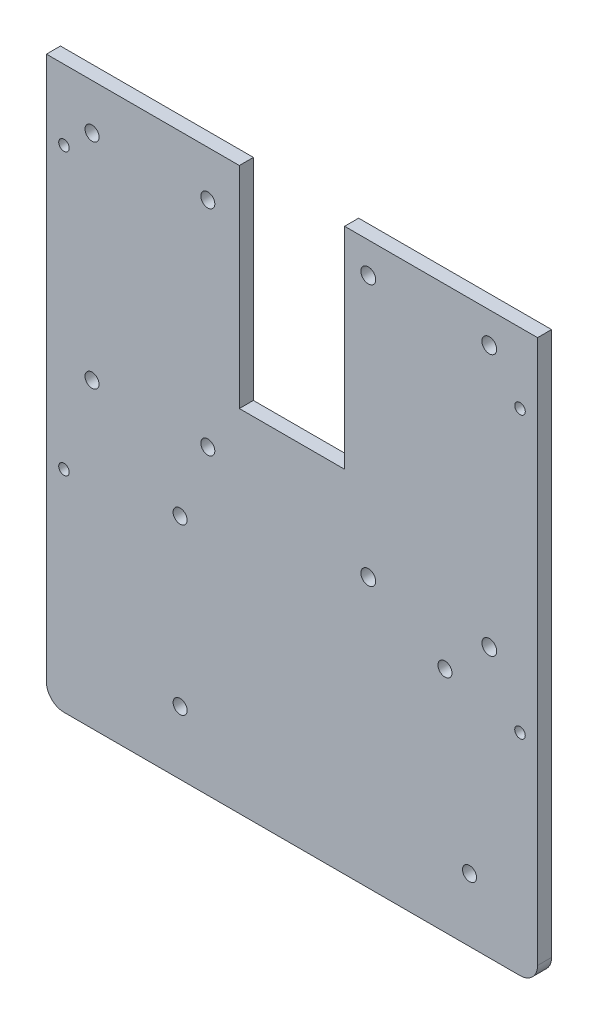
ISO-10303-21;
HEADER;
FILE_DESCRIPTION(('STEP AP214'),'2;1');
FILE_NAME('part.step','',(''),(''),'','','');
FILE_SCHEMA(('AUTOMOTIVE_DESIGN { 1 0 10303 214 1 1 1 1 }'));
ENDSEC;
DATA;
#1=APPLICATION_CONTEXT('core data for automotive mechanical design processes');
#2=APPLICATION_PROTOCOL_DEFINITION('international standard','automotive_design',2000,#1);
#3=PRODUCT_CONTEXT('',#1,'mechanical');
#4=PRODUCT('Part','Part','',(#3));
#5=PRODUCT_RELATED_PRODUCT_CATEGORY('part','',(#4));
#6=PRODUCT_DEFINITION_FORMATION('','',#4);
#7=PRODUCT_DEFINITION_CONTEXT('part definition',#1,'design');
#8=PRODUCT_DEFINITION('design','',#6,#7);
#9=PRODUCT_DEFINITION_SHAPE('','',#8);
#10=(LENGTH_UNIT() NAMED_UNIT(*) SI_UNIT(.MILLI.,.METRE.));
#11=(NAMED_UNIT(*) PLANE_ANGLE_UNIT() SI_UNIT($,.RADIAN.));
#12=(NAMED_UNIT(*) SI_UNIT($,.STERADIAN.) SOLID_ANGLE_UNIT());
#13=UNCERTAINTY_MEASURE_WITH_UNIT(LENGTH_MEASURE(1.E-05),#10,'distance_accuracy_value','');
#14=(GEOMETRIC_REPRESENTATION_CONTEXT(3) GLOBAL_UNCERTAINTY_ASSIGNED_CONTEXT((#13)) GLOBAL_UNIT_ASSIGNED_CONTEXT((#10,
#11,#12)) REPRESENTATION_CONTEXT('',''));
#15=CARTESIAN_POINT('',(0.,0.,0.));
#16=DIRECTION('',(0.,0.,1.));
#17=DIRECTION('',(1.,0.,0.));
#18=AXIS2_PLACEMENT_3D('',#15,#16,#17);
#19=CARTESIAN_POINT('',(0.,60.,10.));
#20=DIRECTION('',(0.,-1.,0.));
#21=DIRECTION('',(0.,0.,-1.));
#22=AXIS2_PLACEMENT_3D('',#19,#20,#21);
#23=PLANE('',#22);
#24=DIRECTION('',(-1.,0.,0.));
#25=VECTOR('',#24,1.);
#26=CARTESIAN_POINT('',(0.,60.,0.));
#27=LINE('',#26,#25);
#28=CARTESIAN_POINT('',(70.,60.,0.));
#29=VERTEX_POINT('',#28);
#30=CARTESIAN_POINT('',(15.,60.,0.));
#31=VERTEX_POINT('',#30);
#32=EDGE_CURVE('E579',#29,#31,#27,.T.);
#33=ORIENTED_EDGE('',*,*,#32,.T.);
#34=DIRECTION('',(0.,0.,1.));
#35=VECTOR('',#34,1.);
#36=CARTESIAN_POINT('',(15.,60.,10.));
#37=LINE('',#36,#35);
#38=CARTESIAN_POINT('',(15.,60.,4.));
#39=VERTEX_POINT('',#38);
#40=EDGE_CURVE('E13',#31,#39,#37,.T.);
#41=ORIENTED_EDGE('',*,*,#40,.T.);
#42=DIRECTION('',(1.,0.,0.));
#43=VECTOR('',#42,1.);
#44=CARTESIAN_POINT('',(0.,60.,4.));
#45=LINE('',#44,#43);
#46=CARTESIAN_POINT('',(70.,60.,4.));
#47=VERTEX_POINT('',#46);
#48=EDGE_CURVE('E105',#39,#47,#45,.T.);
#49=ORIENTED_EDGE('',*,*,#48,.T.);
#50=DIRECTION('',(0.,0.,-1.));
#51=VECTOR('',#50,1.);
#52=CARTESIAN_POINT('',(70.,60.,10.));
#53=LINE('',#52,#51);
#54=EDGE_CURVE('E209',#47,#29,#53,.T.);
#55=ORIENTED_EDGE('',*,*,#54,.T.);
#56=EDGE_LOOP('',(#33,#41,#49,#55));
#57=FACE_BOUND('',#56,.T.);
#58=ADVANCED_FACE('F81',(#57),#23,.F.);
#59=CARTESIAN_POINT('',(-70.,100.,4.));
#60=DIRECTION('',(1.,0.,0.));
#61=DIRECTION('',(0.,1.,0.));
#62=AXIS2_PLACEMENT_3D('',#59,#60,#61);
#63=PLANE('',#62);
#64=DIRECTION('',(0.,-1.,0.));
#65=VECTOR('',#64,1.);
#66=CARTESIAN_POINT('',(-70.,100.,4.));
#67=LINE('',#66,#65);
#68=CARTESIAN_POINT('',(-70.,60.,4.));
#69=VERTEX_POINT('',#68);
#70=CARTESIAN_POINT('',(-70.,-95.,4.));
#71=VERTEX_POINT('',#70);
#72=EDGE_CURVE('E256',#69,#71,#67,.T.);
#73=ORIENTED_EDGE('',*,*,#72,.F.);
#74=DIRECTION('',(0.,0.,-1.));
#75=VECTOR('',#74,1.);
#76=CARTESIAN_POINT('',(-70.,60.,10.));
#77=LINE('',#76,#75);
#78=CARTESIAN_POINT('',(-70.,60.,0.));
#79=VERTEX_POINT('',#78);
#80=EDGE_CURVE('E470',#69,#79,#77,.T.);
#81=ORIENTED_EDGE('',*,*,#80,.T.);
#82=DIRECTION('',(0.,-1.,0.));
#83=VECTOR('',#82,1.);
#84=CARTESIAN_POINT('',(-70.,100.,0.));
#85=LINE('',#84,#83);
#86=CARTESIAN_POINT('',(-70.,-95.,0.));
#87=VERTEX_POINT('',#86);
#88=EDGE_CURVE('E282',#79,#87,#85,.T.);
#89=ORIENTED_EDGE('',*,*,#88,.T.);
#90=DIRECTION('',(0.,0.,-1.));
#91=VECTOR('',#90,1.);
#92=CARTESIAN_POINT('',(-70.,-95.,4.));
#93=LINE('',#92,#91);
#94=EDGE_CURVE('E258',#87,#71,#93,.F.);
#95=ORIENTED_EDGE('',*,*,#94,.T.);
#96=EDGE_LOOP('',(#73,#81,#89,#95));
#97=FACE_BOUND('',#96,.T.);
#98=ADVANCED_FACE('F295',(#97),#63,.F.);
#99=CARTESIAN_POINT('',(0.,0.,4.));
#100=DIRECTION('',(0.,0.,1.));
#101=DIRECTION('',(1.,0.,0.));
#102=AXIS2_PLACEMENT_3D('',#99,#100,#101);
#103=PLANE('',#102);
#104=CARTESIAN_POINT('',(-56.9999999999984,-13.9999999999965,4.));
#105=DIRECTION('',(0.,0.,1.));
#106=DIRECTION('',(1.,0.,0.));
#107=AXIS2_PLACEMENT_3D('',#104,#105,#106);
#108=CIRCLE('',#107,2.);
#109=CARTESIAN_POINT('',(-54.9999999999984,-13.9999999999965,4.));
#110=VERTEX_POINT('',#109);
#111=EDGE_CURVE('E368',#110,#110,#108,.T.);
#112=ORIENTED_EDGE('',*,*,#111,.F.);
#113=EDGE_LOOP('',(#112));
#114=FACE_BOUND('',#113,.T.);
#115=CARTESIAN_POINT('',(-23.9999999999984,-13.9999999999964,4.));
#116=DIRECTION('',(0.,0.,1.));
#117=DIRECTION('',(1.,0.,0.));
#118=AXIS2_PLACEMENT_3D('',#115,#116,#117);
#119=CIRCLE('',#118,2.00000000000001);
#120=CARTESIAN_POINT('',(-21.9999999999984,-13.9999999999964,4.));
#121=VERTEX_POINT('',#120);
#122=EDGE_CURVE('E355',#121,#121,#119,.T.);
#123=ORIENTED_EDGE('',*,*,#122,.F.);
#124=EDGE_LOOP('',(#123));
#125=FACE_BOUND('',#124,.T.);
#126=CARTESIAN_POINT('',(-56.9999999999986,47.0000000000035,4.));
#127=DIRECTION('',(0.,0.,1.));
#128=DIRECTION('',(1.,0.,0.));
#129=AXIS2_PLACEMENT_3D('',#126,#127,#128);
#130=CIRCLE('',#129,2.);
#131=CARTESIAN_POINT('',(-54.9999999999986,47.0000000000035,4.));
#132=VERTEX_POINT('',#131);
#133=EDGE_CURVE('E352',#132,#132,#130,.T.);
#134=ORIENTED_EDGE('',*,*,#133,.F.);
#135=EDGE_LOOP('',(#134));
#136=FACE_BOUND('',#135,.T.);
#137=CARTESIAN_POINT('',(-23.9999999999986,47.0000000000036,4.));
#138=DIRECTION('',(0.,0.,1.));
#139=DIRECTION('',(1.,0.,0.));
#140=AXIS2_PLACEMENT_3D('',#137,#138,#139);
#141=CIRCLE('',#140,2.00000000000001);
#142=CARTESIAN_POINT('',(-21.9999999999986,47.0000000000036,4.));
#143=VERTEX_POINT('',#142);
#144=EDGE_CURVE('E349',#143,#143,#141,.T.);
#145=ORIENTED_EDGE('',*,*,#144,.F.);
#146=EDGE_LOOP('',(#145));
#147=FACE_BOUND('',#146,.T.);
#148=CARTESIAN_POINT('',(-31.8899554742806,-82.,4.));
#149=DIRECTION('',(0.,0.,1.));
#150=DIRECTION('',(1.,0.,0.));
#151=AXIS2_PLACEMENT_3D('',#148,#149,#150);
#152=CIRCLE('',#151,2.);
#153=CARTESIAN_POINT('',(-29.8899554742806,-82.,4.));
#154=VERTEX_POINT('',#153);
#155=EDGE_CURVE('E345',#154,#154,#152,.T.);
#156=ORIENTED_EDGE('',*,*,#155,.F.);
#157=EDGE_LOOP('',(#156));
#158=FACE_BOUND('',#157,.T.);
#159=CARTESIAN_POINT('',(-31.8899554742806,-35.,4.));
#160=DIRECTION('',(0.,0.,1.));
#161=DIRECTION('',(1.,0.,0.));
#162=AXIS2_PLACEMENT_3D('',#159,#160,#161);
#163=CIRCLE('',#162,2.);
#164=CARTESIAN_POINT('',(-29.8899554742806,-35.,4.));
#165=VERTEX_POINT('',#164);
#166=EDGE_CURVE('E341',#165,#165,#163,.T.);
#167=ORIENTED_EDGE('',*,*,#166,.F.);
#168=EDGE_LOOP('',(#167));
#169=FACE_BOUND('',#168,.T.);
#170=CARTESIAN_POINT('',(50.6100445257194,-82.,4.));
#171=DIRECTION('',(0.,0.,1.));
#172=DIRECTION('',(1.,0.,0.));
#173=AXIS2_PLACEMENT_3D('',#170,#171,#172);
#174=CIRCLE('',#173,2.);
#175=CARTESIAN_POINT('',(52.6100445257194,-82.,4.));
#176=VERTEX_POINT('',#175);
#177=EDGE_CURVE('E337',#176,#176,#174,.T.);
#178=ORIENTED_EDGE('',*,*,#177,.F.);
#179=EDGE_LOOP('',(#178));
#180=FACE_BOUND('',#179,.T.);
#181=CARTESIAN_POINT('',(43.6100445257194,-35.,4.));
#182=DIRECTION('',(0.,0.,1.));
#183=DIRECTION('',(1.,0.,0.));
#184=AXIS2_PLACEMENT_3D('',#181,#182,#183);
#185=CIRCLE('',#184,2.);
#186=CARTESIAN_POINT('',(45.6100445257194,-35.,4.));
#187=VERTEX_POINT('',#186);
#188=EDGE_CURVE('E333',#187,#187,#185,.T.);
#189=ORIENTED_EDGE('',*,*,#188,.F.);
#190=EDGE_LOOP('',(#189));
#191=FACE_BOUND('',#190,.T.);
#192=CARTESIAN_POINT('',(21.75,-23.249999999999,4.));
#193=DIRECTION('',(0.,0.,1.));
#194=DIRECTION('',(1.,0.,0.));
#195=AXIS2_PLACEMENT_3D('',#192,#193,#194);
#196=CIRCLE('',#195,2.11233769424887);
#197=CARTESIAN_POINT('',(23.8623376942489,-23.249999999999,4.));
#198=VERTEX_POINT('',#197);
#199=EDGE_CURVE('E329',#198,#198,#196,.T.);
#200=ORIENTED_EDGE('',*,*,#199,.F.);
#201=EDGE_LOOP('',(#200));
#202=FACE_BOUND('',#201,.T.);
#203=CARTESIAN_POINT('',(21.7499999999997,51.2500000000011,4.));
#204=DIRECTION('',(0.,0.,1.));
#205=DIRECTION('',(1.,0.,0.));
#206=AXIS2_PLACEMENT_3D('',#203,#204,#205);
#207=CIRCLE('',#206,2.11233769424887);
#208=CARTESIAN_POINT('',(23.8623376942486,51.2500000000011,4.));
#209=VERTEX_POINT('',#208);
#210=EDGE_CURVE('E325',#209,#209,#207,.T.);
#211=ORIENTED_EDGE('',*,*,#210,.F.);
#212=EDGE_LOOP('',(#211));
#213=FACE_BOUND('',#212,.T.);
#214=CARTESIAN_POINT('',(56.25,-23.2499999999988,4.));
#215=DIRECTION('',(0.,0.,1.));
#216=DIRECTION('',(1.,0.,0.));
#217=AXIS2_PLACEMENT_3D('',#214,#215,#216);
#218=CIRCLE('',#217,2.11233769424887);
#219=CARTESIAN_POINT('',(58.3623376942489,-23.2499999999988,4.));
#220=VERTEX_POINT('',#219);
#221=EDGE_CURVE('E321',#220,#220,#218,.T.);
#222=ORIENTED_EDGE('',*,*,#221,.F.);
#223=EDGE_LOOP('',(#222));
#224=FACE_BOUND('',#223,.T.);
#225=CARTESIAN_POINT('',(56.2499999999997,51.2500000000012,4.));
#226=DIRECTION('',(0.,0.,1.));
#227=DIRECTION('',(1.,0.,0.));
#228=AXIS2_PLACEMENT_3D('',#225,#226,#227);
#229=CIRCLE('',#228,2.11233769424887);
#230=CARTESIAN_POINT('',(58.3623376942486,51.2500000000012,4.));
#231=VERTEX_POINT('',#230);
#232=EDGE_CURVE('E317',#231,#231,#229,.T.);
#233=ORIENTED_EDGE('',*,*,#232,.F.);
#234=EDGE_LOOP('',(#233));
#235=FACE_BOUND('',#234,.T.);
#236=DIRECTION('',(0.,1.,0.));
#237=VECTOR('',#236,1.);
#238=CARTESIAN_POINT('',(15.,0.,4.));
#239=LINE('',#238,#237);
#240=CARTESIAN_POINT('',(15.,0.,4.));
#241=VERTEX_POINT('',#240);
#242=EDGE_CURVE('E192',#241,#39,#239,.T.);
#243=ORIENTED_EDGE('',*,*,#242,.F.);
#244=DIRECTION('',(1.,0.,0.));
#245=VECTOR('',#244,1.);
#246=CARTESIAN_POINT('',(0.,0.,4.));
#247=LINE('',#246,#245);
#248=CARTESIAN_POINT('',(-15.,0.,4.));
#249=VERTEX_POINT('',#248);
#250=EDGE_CURVE('E167',#249,#241,#247,.T.);
#251=ORIENTED_EDGE('',*,*,#250,.F.);
#252=DIRECTION('',(0.,-1.,0.));
#253=VECTOR('',#252,1.);
#254=CARTESIAN_POINT('',(-15.,0.,4.));
#255=LINE('',#254,#253);
#256=CARTESIAN_POINT('',(-15.,60.,4.));
#257=VERTEX_POINT('',#256);
#258=EDGE_CURVE('E187',#257,#249,#255,.T.);
#259=ORIENTED_EDGE('',*,*,#258,.F.);
#260=EDGE_CURVE('E203',#69,#257,#45,.T.);
#261=ORIENTED_EDGE('',*,*,#260,.F.);
#262=ORIENTED_EDGE('',*,*,#72,.T.);
#263=CARTESIAN_POINT('',(-65.,-95.,4.));
#264=DIRECTION('',(0.,0.,1.));
#265=DIRECTION('',(1.,0.,0.));
#266=AXIS2_PLACEMENT_3D('',#263,#264,#265);
#267=CIRCLE('',#266,5.);
#268=CARTESIAN_POINT('',(-65.,-100.,4.));
#269=VERTEX_POINT('',#268);
#270=EDGE_CURVE('E264',#71,#269,#267,.T.);
#271=ORIENTED_EDGE('',*,*,#270,.T.);
#272=DIRECTION('',(1.,0.,0.));
#273=VECTOR('',#272,1.);
#274=CARTESIAN_POINT('',(-70.,-100.,4.));
#275=LINE('',#274,#273);
#276=CARTESIAN_POINT('',(65.,-100.,4.));
#277=VERTEX_POINT('',#276);
#278=EDGE_CURVE('E268',#269,#277,#275,.T.);
#279=ORIENTED_EDGE('',*,*,#278,.T.);
#280=CARTESIAN_POINT('',(65.,-95.,4.));
#281=DIRECTION('',(0.,0.,1.));
#282=DIRECTION('',(1.,0.,0.));
#283=AXIS2_PLACEMENT_3D('',#280,#281,#282);
#284=CIRCLE('',#283,5.);
#285=CARTESIAN_POINT('',(70.,-95.,4.));
#286=VERTEX_POINT('',#285);
#287=EDGE_CURVE('E260',#277,#286,#284,.T.);
#288=ORIENTED_EDGE('',*,*,#287,.T.);
#289=DIRECTION('',(0.,1.,0.));
#290=VECTOR('',#289,1.);
#291=CARTESIAN_POINT('',(70.,100.,4.));
#292=LINE('',#291,#290);
#293=EDGE_CURVE('E251',#286,#47,#292,.T.);
#294=ORIENTED_EDGE('',*,*,#293,.T.);
#295=ORIENTED_EDGE('',*,*,#48,.F.);
#296=EDGE_LOOP('',(#243,#251,#259,#261,#262,#271,#279,#288,#294,#295));
#297=FACE_BOUND('',#296,.T.);
#298=CARTESIAN_POINT('',(65.,-40.,4.));
#299=DIRECTION('',(0.,0.,1.));
#300=DIRECTION('',(1.,0.,0.));
#301=AXIS2_PLACEMENT_3D('',#298,#299,#300);
#302=CIRCLE('',#301,1.5);
#303=CARTESIAN_POINT('',(66.5,-40.,4.));
#304=VERTEX_POINT('',#303);
#305=EDGE_CURVE('E223',#304,#304,#302,.T.);
#306=ORIENTED_EDGE('',*,*,#305,.F.);
#307=EDGE_LOOP('',(#306));
#308=FACE_BOUND('',#307,.T.);
#309=CARTESIAN_POINT('',(-65.,40.,4.));
#310=DIRECTION('',(0.,0.,1.));
#311=DIRECTION('',(1.,0.,0.));
#312=AXIS2_PLACEMENT_3D('',#309,#310,#311);
#313=CIRCLE('',#312,1.5);
#314=CARTESIAN_POINT('',(-63.5,40.,4.));
#315=VERTEX_POINT('',#314);
#316=EDGE_CURVE('E239',#315,#315,#313,.T.);
#317=ORIENTED_EDGE('',*,*,#316,.F.);
#318=EDGE_LOOP('',(#317));
#319=FACE_BOUND('',#318,.T.);
#320=CARTESIAN_POINT('',(-65.,-40.,4.));
#321=DIRECTION('',(0.,0.,1.));
#322=DIRECTION('',(-1.,0.,0.));
#323=AXIS2_PLACEMENT_3D('',#320,#321,#322);
#324=CIRCLE('',#323,1.5);
#325=CARTESIAN_POINT('',(-66.5,-40.,4.));
#326=VERTEX_POINT('',#325);
#327=EDGE_CURVE('E232',#326,#326,#324,.T.);
#328=ORIENTED_EDGE('',*,*,#327,.F.);
#329=EDGE_LOOP('',(#328));
#330=FACE_BOUND('',#329,.T.);
#331=CARTESIAN_POINT('',(65.,40.,4.));
#332=DIRECTION('',(0.,0.,1.));
#333=DIRECTION('',(-1.,0.,0.));
#334=AXIS2_PLACEMENT_3D('',#331,#332,#333);
#335=CIRCLE('',#334,1.5);
#336=CARTESIAN_POINT('',(63.5,40.,4.));
#337=VERTEX_POINT('',#336);
#338=EDGE_CURVE('E211',#337,#337,#335,.T.);
#339=ORIENTED_EDGE('',*,*,#338,.F.);
#340=EDGE_LOOP('',(#339));
#341=FACE_BOUND('',#340,.T.);
#342=ADVANCED_FACE('F423',(#114,#125,#136,#147,#158,#169,#180,#191,#202,#213,#224,#235,#297,
#308,#319,#330,#341),#103,.T.);
#343=CARTESIAN_POINT('',(0.,0.,0.));
#344=DIRECTION('',(0.,0.,1.));
#345=DIRECTION('',(1.,0.,0.));
#346=AXIS2_PLACEMENT_3D('',#343,#344,#345);
#347=PLANE('',#346);
#348=CARTESIAN_POINT('',(-56.9999999999984,-13.9999999999965,0.));
#349=DIRECTION('',(0.,0.,1.));
#350=DIRECTION('',(1.,0.,0.));
#351=AXIS2_PLACEMENT_3D('',#348,#349,#350);
#352=CIRCLE('',#351,2.);
#353=CARTESIAN_POINT('',(-54.9999999999984,-13.9999999999965,0.));
#354=VERTEX_POINT('',#353);
#355=EDGE_CURVE('E85',#354,#354,#352,.T.);
#356=ORIENTED_EDGE('',*,*,#355,.T.);
#357=EDGE_LOOP('',(#356));
#358=FACE_BOUND('',#357,.T.);
#359=CARTESIAN_POINT('',(-23.9999999999984,-13.9999999999964,0.));
#360=DIRECTION('',(0.,0.,1.));
#361=DIRECTION('',(1.,0.,0.));
#362=AXIS2_PLACEMENT_3D('',#359,#360,#361);
#363=CIRCLE('',#362,2.00000000000001);
#364=CARTESIAN_POINT('',(-21.9999999999984,-13.9999999999964,0.));
#365=VERTEX_POINT('',#364);
#366=EDGE_CURVE('E353',#365,#365,#363,.T.);
#367=ORIENTED_EDGE('',*,*,#366,.T.);
#368=EDGE_LOOP('',(#367));
#369=FACE_BOUND('',#368,.T.);
#370=CARTESIAN_POINT('',(-56.9999999999986,47.0000000000035,0.));
#371=DIRECTION('',(0.,0.,1.));
#372=DIRECTION('',(1.,0.,0.));
#373=AXIS2_PLACEMENT_3D('',#370,#371,#372);
#374=CIRCLE('',#373,2.);
#375=CARTESIAN_POINT('',(-54.9999999999986,47.0000000000035,0.));
#376=VERTEX_POINT('',#375);
#377=EDGE_CURVE('E350',#376,#376,#374,.T.);
#378=ORIENTED_EDGE('',*,*,#377,.T.);
#379=EDGE_LOOP('',(#378));
#380=FACE_BOUND('',#379,.T.);
#381=CARTESIAN_POINT('',(-23.9999999999986,47.0000000000036,0.));
#382=DIRECTION('',(0.,0.,1.));
#383=DIRECTION('',(1.,0.,0.));
#384=AXIS2_PLACEMENT_3D('',#381,#382,#383);
#385=CIRCLE('',#384,2.00000000000001);
#386=CARTESIAN_POINT('',(-21.9999999999986,47.0000000000036,0.));
#387=VERTEX_POINT('',#386);
#388=EDGE_CURVE('E346',#387,#387,#385,.T.);
#389=ORIENTED_EDGE('',*,*,#388,.T.);
#390=EDGE_LOOP('',(#389));
#391=FACE_BOUND('',#390,.T.);
#392=CARTESIAN_POINT('',(-31.8899554742806,-82.,0.));
#393=DIRECTION('',(0.,0.,1.));
#394=DIRECTION('',(1.,0.,0.));
#395=AXIS2_PLACEMENT_3D('',#392,#393,#394);
#396=CIRCLE('',#395,2.);
#397=CARTESIAN_POINT('',(-29.8899554742806,-82.,0.));
#398=VERTEX_POINT('',#397);
#399=EDGE_CURVE('E342',#398,#398,#396,.T.);
#400=ORIENTED_EDGE('',*,*,#399,.T.);
#401=EDGE_LOOP('',(#400));
#402=FACE_BOUND('',#401,.T.);
#403=CARTESIAN_POINT('',(-31.8899554742806,-35.,0.));
#404=DIRECTION('',(0.,0.,1.));
#405=DIRECTION('',(1.,0.,0.));
#406=AXIS2_PLACEMENT_3D('',#403,#404,#405);
#407=CIRCLE('',#406,2.);
#408=CARTESIAN_POINT('',(-29.8899554742806,-35.,0.));
#409=VERTEX_POINT('',#408);
#410=EDGE_CURVE('E338',#409,#409,#407,.T.);
#411=ORIENTED_EDGE('',*,*,#410,.T.);
#412=EDGE_LOOP('',(#411));
#413=FACE_BOUND('',#412,.T.);
#414=CARTESIAN_POINT('',(50.6100445257194,-82.,0.));
#415=DIRECTION('',(0.,0.,1.));
#416=DIRECTION('',(1.,0.,0.));
#417=AXIS2_PLACEMENT_3D('',#414,#415,#416);
#418=CIRCLE('',#417,2.);
#419=CARTESIAN_POINT('',(52.6100445257194,-82.,0.));
#420=VERTEX_POINT('',#419);
#421=EDGE_CURVE('E334',#420,#420,#418,.T.);
#422=ORIENTED_EDGE('',*,*,#421,.T.);
#423=EDGE_LOOP('',(#422));
#424=FACE_BOUND('',#423,.T.);
#425=CARTESIAN_POINT('',(43.6100445257194,-35.,0.));
#426=DIRECTION('',(0.,0.,1.));
#427=DIRECTION('',(1.,0.,0.));
#428=AXIS2_PLACEMENT_3D('',#425,#426,#427);
#429=CIRCLE('',#428,2.);
#430=CARTESIAN_POINT('',(45.6100445257194,-35.,0.));
#431=VERTEX_POINT('',#430);
#432=EDGE_CURVE('E330',#431,#431,#429,.T.);
#433=ORIENTED_EDGE('',*,*,#432,.T.);
#434=EDGE_LOOP('',(#433));
#435=FACE_BOUND('',#434,.T.);
#436=CARTESIAN_POINT('',(21.75,-23.249999999999,0.));
#437=DIRECTION('',(0.,0.,1.));
#438=DIRECTION('',(1.,0.,0.));
#439=AXIS2_PLACEMENT_3D('',#436,#437,#438);
#440=CIRCLE('',#439,2.11233769424887);
#441=CARTESIAN_POINT('',(23.8623376942489,-23.249999999999,0.));
#442=VERTEX_POINT('',#441);
#443=EDGE_CURVE('E326',#442,#442,#440,.T.);
#444=ORIENTED_EDGE('',*,*,#443,.T.);
#445=EDGE_LOOP('',(#444));
#446=FACE_BOUND('',#445,.T.);
#447=CARTESIAN_POINT('',(21.7499999999997,51.2500000000011,0.));
#448=DIRECTION('',(0.,0.,1.));
#449=DIRECTION('',(1.,0.,0.));
#450=AXIS2_PLACEMENT_3D('',#447,#448,#449);
#451=CIRCLE('',#450,2.11233769424887);
#452=CARTESIAN_POINT('',(23.8623376942486,51.2500000000011,0.));
#453=VERTEX_POINT('',#452);
#454=EDGE_CURVE('E322',#453,#453,#451,.T.);
#455=ORIENTED_EDGE('',*,*,#454,.T.);
#456=EDGE_LOOP('',(#455));
#457=FACE_BOUND('',#456,.T.);
#458=CARTESIAN_POINT('',(56.25,-23.2499999999988,0.));
#459=DIRECTION('',(0.,0.,1.));
#460=DIRECTION('',(1.,0.,0.));
#461=AXIS2_PLACEMENT_3D('',#458,#459,#460);
#462=CIRCLE('',#461,2.11233769424887);
#463=CARTESIAN_POINT('',(58.3623376942489,-23.2499999999988,0.));
#464=VERTEX_POINT('',#463);
#465=EDGE_CURVE('E318',#464,#464,#462,.T.);
#466=ORIENTED_EDGE('',*,*,#465,.T.);
#467=EDGE_LOOP('',(#466));
#468=FACE_BOUND('',#467,.T.);
#469=CARTESIAN_POINT('',(56.2499999999997,51.2500000000012,0.));
#470=DIRECTION('',(0.,0.,1.));
#471=DIRECTION('',(1.,0.,0.));
#472=AXIS2_PLACEMENT_3D('',#469,#470,#471);
#473=CIRCLE('',#472,2.11233769424887);
#474=CARTESIAN_POINT('',(58.3623376942486,51.2500000000012,0.));
#475=VERTEX_POINT('',#474);
#476=EDGE_CURVE('E178',#475,#475,#473,.T.);
#477=ORIENTED_EDGE('',*,*,#476,.T.);
#478=EDGE_LOOP('',(#477));
#479=FACE_BOUND('',#478,.T.);
#480=DIRECTION('',(-1.,0.,0.));
#481=VECTOR('',#480,1.);
#482=CARTESIAN_POINT('',(15.,0.,0.));
#483=LINE('',#482,#481);
#484=CARTESIAN_POINT('',(15.,0.,0.));
#485=VERTEX_POINT('',#484);
#486=CARTESIAN_POINT('',(-15.,0.,0.));
#487=VERTEX_POINT('',#486);
#488=EDGE_CURVE('E165',#485,#487,#483,.T.);
#489=ORIENTED_EDGE('',*,*,#488,.F.);
#490=DIRECTION('',(0.,-1.,0.));
#491=VECTOR('',#490,1.);
#492=CARTESIAN_POINT('',(15.,60.,0.));
#493=LINE('',#492,#491);
#494=EDGE_CURVE('E173',#31,#485,#493,.T.);
#495=ORIENTED_EDGE('',*,*,#494,.F.);
#496=ORIENTED_EDGE('',*,*,#32,.F.);
#497=DIRECTION('',(0.,1.,0.));
#498=VECTOR('',#497,1.);
#499=CARTESIAN_POINT('',(70.,100.,0.));
#500=LINE('',#499,#498);
#501=CARTESIAN_POINT('',(70.,-95.,0.));
#502=VERTEX_POINT('',#501);
#503=EDGE_CURVE('E244',#502,#29,#500,.T.);
#504=ORIENTED_EDGE('',*,*,#503,.F.);
#505=CARTESIAN_POINT('',(65.,-95.,0.));
#506=DIRECTION('',(0.,0.,1.));
#507=DIRECTION('',(1.,0.,0.));
#508=AXIS2_PLACEMENT_3D('',#505,#506,#507);
#509=CIRCLE('',#508,5.);
#510=CARTESIAN_POINT('',(65.,-100.,0.));
#511=VERTEX_POINT('',#510);
#512=EDGE_CURVE('E285',#502,#511,#509,.F.);
#513=ORIENTED_EDGE('',*,*,#512,.T.);
#514=DIRECTION('',(1.,0.,0.));
#515=VECTOR('',#514,1.);
#516=CARTESIAN_POINT('',(-70.,-100.,0.));
#517=LINE('',#516,#515);
#518=CARTESIAN_POINT('',(-65.,-100.,0.));
#519=VERTEX_POINT('',#518);
#520=EDGE_CURVE('E257',#519,#511,#517,.T.);
#521=ORIENTED_EDGE('',*,*,#520,.F.);
#522=CARTESIAN_POINT('',(-65.,-95.,0.));
#523=DIRECTION('',(0.,0.,1.));
#524=DIRECTION('',(1.,0.,0.));
#525=AXIS2_PLACEMENT_3D('',#522,#523,#524);
#526=CIRCLE('',#525,5.);
#527=EDGE_CURVE('E286',#519,#87,#526,.F.);
#528=ORIENTED_EDGE('',*,*,#527,.T.);
#529=ORIENTED_EDGE('',*,*,#88,.F.);
#530=CARTESIAN_POINT('',(-15.,60.,0.));
#531=VERTEX_POINT('',#530);
#532=EDGE_CURVE('E582',#531,#79,#27,.T.);
#533=ORIENTED_EDGE('',*,*,#532,.F.);
#534=DIRECTION('',(0.,1.,0.));
#535=VECTOR('',#534,1.);
#536=CARTESIAN_POINT('',(-15.,60.,0.));
#537=LINE('',#536,#535);
#538=EDGE_CURVE('E98',#487,#531,#537,.T.);
#539=ORIENTED_EDGE('',*,*,#538,.F.);
#540=EDGE_LOOP('',(#489,#495,#496,#504,#513,#521,#528,#529,#533,#539));
#541=FACE_BOUND('',#540,.T.);
#542=CARTESIAN_POINT('',(-65.,40.,0.));
#543=DIRECTION('',(0.,0.,1.));
#544=DIRECTION('',(1.,0.,0.));
#545=AXIS2_PLACEMENT_3D('',#542,#543,#544);
#546=CIRCLE('',#545,1.5);
#547=CARTESIAN_POINT('',(-63.5,40.,0.));
#548=VERTEX_POINT('',#547);
#549=EDGE_CURVE('E237',#548,#548,#546,.T.);
#550=ORIENTED_EDGE('',*,*,#549,.T.);
#551=EDGE_LOOP('',(#550));
#552=FACE_BOUND('',#551,.T.);
#553=CARTESIAN_POINT('',(-65.,-40.,0.));
#554=DIRECTION('',(0.,0.,1.));
#555=DIRECTION('',(-1.,0.,0.));
#556=AXIS2_PLACEMENT_3D('',#553,#554,#555);
#557=CIRCLE('',#556,1.5);
#558=CARTESIAN_POINT('',(-66.5,-40.,0.));
#559=VERTEX_POINT('',#558);
#560=EDGE_CURVE('E228',#559,#559,#557,.T.);
#561=ORIENTED_EDGE('',*,*,#560,.T.);
#562=EDGE_LOOP('',(#561));
#563=FACE_BOUND('',#562,.T.);
#564=CARTESIAN_POINT('',(65.,-40.,0.));
#565=DIRECTION('',(0.,0.,1.));
#566=DIRECTION('',(1.,0.,0.));
#567=AXIS2_PLACEMENT_3D('',#564,#565,#566);
#568=CIRCLE('',#567,1.5);
#569=CARTESIAN_POINT('',(66.5,-40.,0.));
#570=VERTEX_POINT('',#569);
#571=EDGE_CURVE('E229',#570,#570,#568,.T.);
#572=ORIENTED_EDGE('',*,*,#571,.T.);
#573=EDGE_LOOP('',(#572));
#574=FACE_BOUND('',#573,.T.);
#575=CARTESIAN_POINT('',(65.,40.,0.));
#576=DIRECTION('',(0.,0.,1.));
#577=DIRECTION('',(-1.,0.,0.));
#578=AXIS2_PLACEMENT_3D('',#575,#576,#577);
#579=CIRCLE('',#578,1.5);
#580=CARTESIAN_POINT('',(63.5,40.,0.));
#581=VERTEX_POINT('',#580);
#582=EDGE_CURVE('E208',#581,#581,#579,.T.);
#583=ORIENTED_EDGE('',*,*,#582,.T.);
#584=EDGE_LOOP('',(#583));
#585=FACE_BOUND('',#584,.T.);
#586=ADVANCED_FACE('F180',(#358,#369,#380,#391,#402,#413,#424,#435,#446,#457,#468,#479,#541,
#552,#563,#574,#585),#347,.F.);
#587=CARTESIAN_POINT('',(70.,100.,4.));
#588=DIRECTION('',(-1.,0.,0.));
#589=DIRECTION('',(0.,-1.,0.));
#590=AXIS2_PLACEMENT_3D('',#587,#588,#589);
#591=PLANE('',#590);
#592=ORIENTED_EDGE('',*,*,#503,.T.);
#593=ORIENTED_EDGE('',*,*,#54,.F.);
#594=ORIENTED_EDGE('',*,*,#293,.F.);
#595=DIRECTION('',(0.,0.,-1.));
#596=VECTOR('',#595,1.);
#597=CARTESIAN_POINT('',(70.,-95.,4.));
#598=LINE('',#597,#596);
#599=EDGE_CURVE('E304',#286,#502,#598,.T.);
#600=ORIENTED_EDGE('',*,*,#599,.T.);
#601=EDGE_LOOP('',(#592,#593,#594,#600));
#602=FACE_BOUND('',#601,.T.);
#603=ADVANCED_FACE('F531',(#602),#591,.F.);
#604=CARTESIAN_POINT('',(-70.,-100.,4.));
#605=DIRECTION('',(0.,1.,0.));
#606=DIRECTION('',(0.,0.,1.));
#607=AXIS2_PLACEMENT_3D('',#604,#605,#606);
#608=PLANE('',#607);
#609=ORIENTED_EDGE('',*,*,#278,.F.);
#610=DIRECTION('',(0.,0.,-1.));
#611=VECTOR('',#610,1.);
#612=CARTESIAN_POINT('',(-65.,-100.,4.));
#613=LINE('',#612,#611);
#614=EDGE_CURVE('E283',#269,#519,#613,.T.);
#615=ORIENTED_EDGE('',*,*,#614,.T.);
#616=ORIENTED_EDGE('',*,*,#520,.T.);
#617=DIRECTION('',(0.,0.,-1.));
#618=VECTOR('',#617,1.);
#619=CARTESIAN_POINT('',(65.,-100.,4.));
#620=LINE('',#619,#618);
#621=EDGE_CURVE('E273',#511,#277,#620,.F.);
#622=ORIENTED_EDGE('',*,*,#621,.T.);
#623=EDGE_LOOP('',(#609,#615,#616,#622));
#624=FACE_BOUND('',#623,.T.);
#625=ADVANCED_FACE('F565',(#624),#608,.F.);
#626=CARTESIAN_POINT('',(-65.,40.,4.));
#627=DIRECTION('',(0.,0.,-1.));
#628=DIRECTION('',(-1.,0.,0.));
#629=AXIS2_PLACEMENT_3D('',#626,#627,#628);
#630=CYLINDRICAL_SURFACE('',#629,1.5);
#631=ORIENTED_EDGE('',*,*,#316,.T.);
#632=EDGE_LOOP('',(#631));
#633=FACE_BOUND('',#632,.T.);
#634=ORIENTED_EDGE('',*,*,#549,.F.);
#635=EDGE_LOOP('',(#634));
#636=FACE_BOUND('',#635,.T.);
#637=ADVANCED_FACE('F570',(#633,#636),#630,.F.);
#638=CARTESIAN_POINT('',(-65.,-40.,4.));
#639=DIRECTION('',(0.,0.,-1.));
#640=DIRECTION('',(-1.,0.,0.));
#641=AXIS2_PLACEMENT_3D('',#638,#639,#640);
#642=CYLINDRICAL_SURFACE('',#641,1.5);
#643=ORIENTED_EDGE('',*,*,#327,.T.);
#644=EDGE_LOOP('',(#643));
#645=FACE_BOUND('',#644,.T.);
#646=ORIENTED_EDGE('',*,*,#560,.F.);
#647=EDGE_LOOP('',(#646));
#648=FACE_BOUND('',#647,.T.);
#649=ADVANCED_FACE('F450',(#645,#648),#642,.F.);
#650=CARTESIAN_POINT('',(65.,-40.,4.));
#651=DIRECTION('',(0.,0.,-1.));
#652=DIRECTION('',(-1.,0.,0.));
#653=AXIS2_PLACEMENT_3D('',#650,#651,#652);
#654=CYLINDRICAL_SURFACE('',#653,1.5);
#655=ORIENTED_EDGE('',*,*,#305,.T.);
#656=EDGE_LOOP('',(#655));
#657=FACE_BOUND('',#656,.T.);
#658=ORIENTED_EDGE('',*,*,#571,.F.);
#659=EDGE_LOOP('',(#658));
#660=FACE_BOUND('',#659,.T.);
#661=ADVANCED_FACE('F444',(#657,#660),#654,.F.);
#662=CARTESIAN_POINT('',(65.,40.,4.));
#663=DIRECTION('',(0.,0.,-1.));
#664=DIRECTION('',(-1.,0.,0.));
#665=AXIS2_PLACEMENT_3D('',#662,#663,#664);
#666=CYLINDRICAL_SURFACE('',#665,1.5);
#667=ORIENTED_EDGE('',*,*,#338,.T.);
#668=EDGE_LOOP('',(#667));
#669=FACE_BOUND('',#668,.T.);
#670=ORIENTED_EDGE('',*,*,#582,.F.);
#671=EDGE_LOOP('',(#670));
#672=FACE_BOUND('',#671,.T.);
#673=ADVANCED_FACE('F442',(#669,#672),#666,.F.);
#674=CARTESIAN_POINT('',(-65.,-95.,4.));
#675=DIRECTION('',(0.,0.,-1.));
#676=DIRECTION('',(-1.,0.,0.));
#677=AXIS2_PLACEMENT_3D('',#674,#675,#676);
#678=CYLINDRICAL_SURFACE('',#677,5.);
#679=ORIENTED_EDGE('',*,*,#270,.F.);
#680=ORIENTED_EDGE('',*,*,#94,.F.);
#681=ORIENTED_EDGE('',*,*,#527,.F.);
#682=ORIENTED_EDGE('',*,*,#614,.F.);
#683=EDGE_LOOP('',(#679,#680,#681,#682));
#684=FACE_BOUND('',#683,.T.);
#685=ADVANCED_FACE('F299',(#684),#678,.T.);
#686=CARTESIAN_POINT('',(65.,-95.,4.));
#687=DIRECTION('',(0.,0.,-1.));
#688=DIRECTION('',(-1.,0.,0.));
#689=AXIS2_PLACEMENT_3D('',#686,#687,#688);
#690=CYLINDRICAL_SURFACE('',#689,5.);
#691=ORIENTED_EDGE('',*,*,#287,.F.);
#692=ORIENTED_EDGE('',*,*,#621,.F.);
#693=ORIENTED_EDGE('',*,*,#512,.F.);
#694=ORIENTED_EDGE('',*,*,#599,.F.);
#695=EDGE_LOOP('',(#691,#692,#693,#694));
#696=FACE_BOUND('',#695,.T.);
#697=ADVANCED_FACE('F83',(#696),#690,.T.);
#698=ORIENTED_EDGE('',*,*,#260,.T.);
#699=DIRECTION('',(0.,0.,-1.));
#700=VECTOR('',#699,1.);
#701=CARTESIAN_POINT('',(-15.,60.,10.));
#702=LINE('',#701,#700);
#703=EDGE_CURVE('E90',#257,#531,#702,.T.);
#704=ORIENTED_EDGE('',*,*,#703,.T.);
#705=ORIENTED_EDGE('',*,*,#532,.T.);
#706=ORIENTED_EDGE('',*,*,#80,.F.);
#707=EDGE_LOOP('',(#698,#704,#705,#706));
#708=FACE_BOUND('',#707,.T.);
#709=ADVANCED_FACE('F455',(#708),#23,.F.);
#710=CARTESIAN_POINT('',(15.,60.,10.));
#711=DIRECTION('',(1.,0.,0.));
#712=DIRECTION('',(0.,1.,0.));
#713=AXIS2_PLACEMENT_3D('',#710,#711,#712);
#714=PLANE('',#713);
#715=ORIENTED_EDGE('',*,*,#242,.T.);
#716=ORIENTED_EDGE('',*,*,#40,.F.);
#717=ORIENTED_EDGE('',*,*,#494,.T.);
#718=DIRECTION('',(0.,0.,-1.));
#719=VECTOR('',#718,1.);
#720=CARTESIAN_POINT('',(15.,0.,10.));
#721=LINE('',#720,#719);
#722=EDGE_CURVE('E160',#241,#485,#721,.T.);
#723=ORIENTED_EDGE('',*,*,#722,.F.);
#724=EDGE_LOOP('',(#715,#716,#717,#723));
#725=FACE_BOUND('',#724,.T.);
#726=ADVANCED_FACE('F174',(#725),#714,.F.);
#727=CARTESIAN_POINT('',(-15.,60.,10.));
#728=DIRECTION('',(-1.,0.,0.));
#729=DIRECTION('',(0.,-1.,0.));
#730=AXIS2_PLACEMENT_3D('',#727,#728,#729);
#731=PLANE('',#730);
#732=ORIENTED_EDGE('',*,*,#258,.T.);
#733=DIRECTION('',(0.,0.,-1.));
#734=VECTOR('',#733,1.);
#735=CARTESIAN_POINT('',(-15.,0.,10.));
#736=LINE('',#735,#734);
#737=EDGE_CURVE('E170',#249,#487,#736,.T.);
#738=ORIENTED_EDGE('',*,*,#737,.T.);
#739=ORIENTED_EDGE('',*,*,#538,.T.);
#740=ORIENTED_EDGE('',*,*,#703,.F.);
#741=EDGE_LOOP('',(#732,#738,#739,#740));
#742=FACE_BOUND('',#741,.T.);
#743=ADVANCED_FACE('F467',(#742),#731,.F.);
#744=CARTESIAN_POINT('',(15.,0.,10.));
#745=DIRECTION('',(0.,-1.,0.));
#746=DIRECTION('',(1.,0.,0.));
#747=AXIS2_PLACEMENT_3D('',#744,#745,#746);
#748=PLANE('',#747);
#749=ORIENTED_EDGE('',*,*,#250,.T.);
#750=ORIENTED_EDGE('',*,*,#722,.T.);
#751=ORIENTED_EDGE('',*,*,#488,.T.);
#752=ORIENTED_EDGE('',*,*,#737,.F.);
#753=EDGE_LOOP('',(#749,#750,#751,#752));
#754=FACE_BOUND('',#753,.T.);
#755=ADVANCED_FACE('F162',(#754),#748,.F.);
#756=CARTESIAN_POINT('',(56.2499999999997,51.2500000000012,-6.));
#757=DIRECTION('',(0.,0.,1.));
#758=DIRECTION('',(1.,0.,0.));
#759=AXIS2_PLACEMENT_3D('',#756,#757,#758);
#760=CYLINDRICAL_SURFACE('',#759,2.11233769424887);
#761=ORIENTED_EDGE('',*,*,#232,.T.);
#762=EDGE_LOOP('',(#761));
#763=FACE_BOUND('',#762,.T.);
#764=ORIENTED_EDGE('',*,*,#476,.F.);
#765=EDGE_LOOP('',(#764));
#766=FACE_BOUND('',#765,.T.);
#767=ADVANCED_FACE('F420',(#763,#766),#760,.F.);
#768=CARTESIAN_POINT('',(56.25,-23.2499999999988,-6.));
#769=DIRECTION('',(0.,0.,1.));
#770=DIRECTION('',(1.,0.,0.));
#771=AXIS2_PLACEMENT_3D('',#768,#769,#770);
#772=CYLINDRICAL_SURFACE('',#771,2.11233769424887);
#773=ORIENTED_EDGE('',*,*,#221,.T.);
#774=EDGE_LOOP('',(#773));
#775=FACE_BOUND('',#774,.T.);
#776=ORIENTED_EDGE('',*,*,#465,.F.);
#777=EDGE_LOOP('',(#776));
#778=FACE_BOUND('',#777,.T.);
#779=ADVANCED_FACE('F481',(#775,#778),#772,.F.);
#780=CARTESIAN_POINT('',(21.7499999999997,51.2500000000011,-6.));
#781=DIRECTION('',(0.,0.,1.));
#782=DIRECTION('',(1.,0.,0.));
#783=AXIS2_PLACEMENT_3D('',#780,#781,#782);
#784=CYLINDRICAL_SURFACE('',#783,2.11233769424887);
#785=ORIENTED_EDGE('',*,*,#210,.T.);
#786=EDGE_LOOP('',(#785));
#787=FACE_BOUND('',#786,.T.);
#788=ORIENTED_EDGE('',*,*,#454,.F.);
#789=EDGE_LOOP('',(#788));
#790=FACE_BOUND('',#789,.T.);
#791=ADVANCED_FACE('F484',(#787,#790),#784,.F.);
#792=CARTESIAN_POINT('',(21.75,-23.249999999999,-6.));
#793=DIRECTION('',(0.,0.,1.));
#794=DIRECTION('',(1.,0.,0.));
#795=AXIS2_PLACEMENT_3D('',#792,#793,#794);
#796=CYLINDRICAL_SURFACE('',#795,2.11233769424887);
#797=ORIENTED_EDGE('',*,*,#199,.T.);
#798=EDGE_LOOP('',(#797));
#799=FACE_BOUND('',#798,.T.);
#800=ORIENTED_EDGE('',*,*,#443,.F.);
#801=EDGE_LOOP('',(#800));
#802=FACE_BOUND('',#801,.T.);
#803=ADVANCED_FACE('F488',(#799,#802),#796,.F.);
#804=CARTESIAN_POINT('',(43.6100445257194,-35.,-6.));
#805=DIRECTION('',(0.,0.,1.));
#806=DIRECTION('',(1.,0.,0.));
#807=AXIS2_PLACEMENT_3D('',#804,#805,#806);
#808=CYLINDRICAL_SURFACE('',#807,2.);
#809=ORIENTED_EDGE('',*,*,#188,.T.);
#810=EDGE_LOOP('',(#809));
#811=FACE_BOUND('',#810,.T.);
#812=ORIENTED_EDGE('',*,*,#432,.F.);
#813=EDGE_LOOP('',(#812));
#814=FACE_BOUND('',#813,.T.);
#815=ADVANCED_FACE('F492',(#811,#814),#808,.F.);
#816=CARTESIAN_POINT('',(50.6100445257194,-82.,-6.));
#817=DIRECTION('',(0.,0.,1.));
#818=DIRECTION('',(1.,0.,0.));
#819=AXIS2_PLACEMENT_3D('',#816,#817,#818);
#820=CYLINDRICAL_SURFACE('',#819,2.);
#821=ORIENTED_EDGE('',*,*,#177,.T.);
#822=EDGE_LOOP('',(#821));
#823=FACE_BOUND('',#822,.T.);
#824=ORIENTED_EDGE('',*,*,#421,.F.);
#825=EDGE_LOOP('',(#824));
#826=FACE_BOUND('',#825,.T.);
#827=ADVANCED_FACE('F496',(#823,#826),#820,.F.);
#828=CARTESIAN_POINT('',(-31.8899554742806,-35.,-6.));
#829=DIRECTION('',(0.,0.,1.));
#830=DIRECTION('',(1.,0.,0.));
#831=AXIS2_PLACEMENT_3D('',#828,#829,#830);
#832=CYLINDRICAL_SURFACE('',#831,2.);
#833=ORIENTED_EDGE('',*,*,#166,.T.);
#834=EDGE_LOOP('',(#833));
#835=FACE_BOUND('',#834,.T.);
#836=ORIENTED_EDGE('',*,*,#410,.F.);
#837=EDGE_LOOP('',(#836));
#838=FACE_BOUND('',#837,.T.);
#839=ADVANCED_FACE('F500',(#835,#838),#832,.F.);
#840=CARTESIAN_POINT('',(-31.8899554742806,-82.,-6.));
#841=DIRECTION('',(0.,0.,1.));
#842=DIRECTION('',(1.,0.,0.));
#843=AXIS2_PLACEMENT_3D('',#840,#841,#842);
#844=CYLINDRICAL_SURFACE('',#843,2.);
#845=ORIENTED_EDGE('',*,*,#155,.T.);
#846=EDGE_LOOP('',(#845));
#847=FACE_BOUND('',#846,.T.);
#848=ORIENTED_EDGE('',*,*,#399,.F.);
#849=EDGE_LOOP('',(#848));
#850=FACE_BOUND('',#849,.T.);
#851=ADVANCED_FACE('F504',(#847,#850),#844,.F.);
#852=CARTESIAN_POINT('',(-23.9999999999986,47.0000000000036,-6.));
#853=DIRECTION('',(0.,0.,1.));
#854=DIRECTION('',(1.,0.,0.));
#855=AXIS2_PLACEMENT_3D('',#852,#853,#854);
#856=CYLINDRICAL_SURFACE('',#855,2.00000000000001);
#857=ORIENTED_EDGE('',*,*,#144,.T.);
#858=EDGE_LOOP('',(#857));
#859=FACE_BOUND('',#858,.T.);
#860=ORIENTED_EDGE('',*,*,#388,.F.);
#861=EDGE_LOOP('',(#860));
#862=FACE_BOUND('',#861,.T.);
#863=ADVANCED_FACE('F508',(#859,#862),#856,.F.);
#864=CARTESIAN_POINT('',(-56.9999999999986,47.0000000000035,-6.));
#865=DIRECTION('',(0.,0.,1.));
#866=DIRECTION('',(1.,0.,0.));
#867=AXIS2_PLACEMENT_3D('',#864,#865,#866);
#868=CYLINDRICAL_SURFACE('',#867,2.);
#869=ORIENTED_EDGE('',*,*,#133,.T.);
#870=EDGE_LOOP('',(#869));
#871=FACE_BOUND('',#870,.T.);
#872=ORIENTED_EDGE('',*,*,#377,.F.);
#873=EDGE_LOOP('',(#872));
#874=FACE_BOUND('',#873,.T.);
#875=ADVANCED_FACE('F512',(#871,#874),#868,.F.);
#876=CARTESIAN_POINT('',(-23.9999999999984,-13.9999999999964,-6.));
#877=DIRECTION('',(0.,0.,1.));
#878=DIRECTION('',(1.,0.,0.));
#879=AXIS2_PLACEMENT_3D('',#876,#877,#878);
#880=CYLINDRICAL_SURFACE('',#879,2.00000000000001);
#881=ORIENTED_EDGE('',*,*,#122,.T.);
#882=EDGE_LOOP('',(#881));
#883=FACE_BOUND('',#882,.T.);
#884=ORIENTED_EDGE('',*,*,#366,.F.);
#885=EDGE_LOOP('',(#884));
#886=FACE_BOUND('',#885,.T.);
#887=ADVANCED_FACE('F516',(#883,#886),#880,.F.);
#888=CARTESIAN_POINT('',(-56.9999999999984,-13.9999999999965,-6.));
#889=DIRECTION('',(0.,0.,1.));
#890=DIRECTION('',(1.,0.,0.));
#891=AXIS2_PLACEMENT_3D('',#888,#889,#890);
#892=CYLINDRICAL_SURFACE('',#891,2.);
#893=ORIENTED_EDGE('',*,*,#111,.T.);
#894=EDGE_LOOP('',(#893));
#895=FACE_BOUND('',#894,.T.);
#896=ORIENTED_EDGE('',*,*,#355,.F.);
#897=EDGE_LOOP('',(#896));
#898=FACE_BOUND('',#897,.T.);
#899=ADVANCED_FACE('F520',(#895,#898),#892,.F.);
#900=CLOSED_SHELL('',(#58,#98,#342,#586,#603,#625,#637,#649,#661,#673,#685,#697,#709,#726,#743,
#755,#767,#779,#791,#803,#815,#827,#839,#851,#863,#875,#887,#899));
#901=MANIFOLD_SOLID_BREP('B2',#900);
#902=ADVANCED_BREP_SHAPE_REPRESENTATION('',(#18,#901),#14);
#903=SHAPE_DEFINITION_REPRESENTATION(#9,#902);
ENDSEC;
END-ISO-10303-21;
